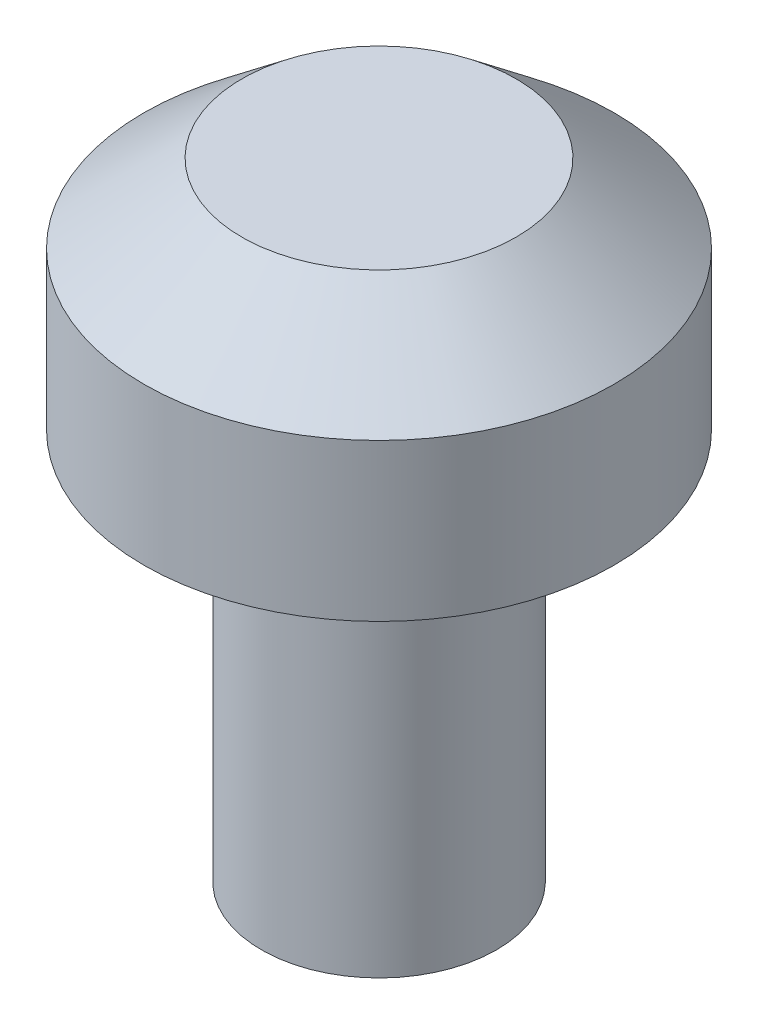
ISO-10303-21;
HEADER;
FILE_DESCRIPTION(('STEP AP214'),'2;1');
FILE_NAME('part.step','',(''),(''),'','','');
FILE_SCHEMA(('AUTOMOTIVE_DESIGN { 1 0 10303 214 1 1 1 1 }'));
ENDSEC;
DATA;
#1=APPLICATION_CONTEXT('core data for automotive mechanical design processes');
#2=APPLICATION_PROTOCOL_DEFINITION('international standard','automotive_design',2000,#1);
#3=PRODUCT_CONTEXT('',#1,'mechanical');
#4=PRODUCT('Part','Part','',(#3));
#5=PRODUCT_RELATED_PRODUCT_CATEGORY('part','',(#4));
#6=PRODUCT_DEFINITION_FORMATION('','',#4);
#7=PRODUCT_DEFINITION_CONTEXT('part definition',#1,'design');
#8=PRODUCT_DEFINITION('design','',#6,#7);
#9=PRODUCT_DEFINITION_SHAPE('','',#8);
#10=(LENGTH_UNIT() NAMED_UNIT(*) SI_UNIT(.MILLI.,.METRE.));
#11=(NAMED_UNIT(*) PLANE_ANGLE_UNIT() SI_UNIT($,.RADIAN.));
#12=(NAMED_UNIT(*) SI_UNIT($,.STERADIAN.) SOLID_ANGLE_UNIT());
#13=UNCERTAINTY_MEASURE_WITH_UNIT(LENGTH_MEASURE(1.E-05),#10,'distance_accuracy_value','');
#14=(GEOMETRIC_REPRESENTATION_CONTEXT(3) GLOBAL_UNCERTAINTY_ASSIGNED_CONTEXT((#13)) GLOBAL_UNIT_ASSIGNED_CONTEXT((#10,
#11,#12)) REPRESENTATION_CONTEXT('',''));
#15=CARTESIAN_POINT('',(0.,0.,0.));
#16=DIRECTION('',(0.,0.,1.));
#17=DIRECTION('',(1.,0.,0.));
#18=AXIS2_PLACEMENT_3D('',#15,#16,#17);
#19=CARTESIAN_POINT('',(0.,0.,0.));
#20=DIRECTION('',(0.,-1.,0.));
#21=DIRECTION('',(1.,0.,0.));
#22=AXIS2_PLACEMENT_3D('',#19,#20,#21);
#23=PLANE('',#22);
#24=CARTESIAN_POINT('',(0.,0.,0.));
#25=DIRECTION('',(0.,-1.,0.));
#26=DIRECTION('',(1.,0.,0.));
#27=AXIS2_PLACEMENT_3D('',#24,#25,#26);
#28=CIRCLE('',#27,1.5);
#29=CARTESIAN_POINT('',(1.5,0.,0.));
#30=VERTEX_POINT('',#29);
#31=EDGE_CURVE('E52',#30,#30,#28,.T.);
#32=ORIENTED_EDGE('',*,*,#31,.T.);
#33=EDGE_LOOP('',(#32));
#34=FACE_BOUND('',#33,.T.);
#35=ADVANCED_FACE('F33',(#34),#23,.T.);
#36=CARTESIAN_POINT('',(0.,8.,0.));
#37=DIRECTION('',(0.,1.,0.));
#38=DIRECTION('',(-1.,0.,0.));
#39=AXIS2_PLACEMENT_3D('',#36,#37,#38);
#40=PLANE('',#39);
#41=CARTESIAN_POINT('',(0.,8.,0.));
#42=DIRECTION('',(0.,-1.,0.));
#43=DIRECTION('',(1.,0.,0.));
#44=AXIS2_PLACEMENT_3D('',#41,#42,#43);
#45=CIRCLE('',#44,1.75);
#46=CARTESIAN_POINT('',(1.75,8.,0.));
#47=VERTEX_POINT('',#46);
#48=EDGE_CURVE('E10',#47,#47,#45,.T.);
#49=ORIENTED_EDGE('',*,*,#48,.F.);
#50=EDGE_LOOP('',(#49));
#51=FACE_BOUND('',#50,.T.);
#52=ADVANCED_FACE('F69',(#51),#40,.T.);
#53=CARTESIAN_POINT('',(0.,7.,0.));
#54=DIRECTION('',(0.,-1.,0.));
#55=DIRECTION('',(1.,0.,0.));
#56=AXIS2_PLACEMENT_3D('',#53,#54,#55);
#57=CONICAL_SURFACE('',#56,3.,0.896055384571343);
#58=ORIENTED_EDGE('',*,*,#48,.T.);
#59=EDGE_LOOP('',(#58));
#60=FACE_BOUND('',#59,.T.);
#61=CARTESIAN_POINT('',(0.,7.,0.));
#62=DIRECTION('',(0.,-1.,0.));
#63=DIRECTION('',(1.,0.,0.));
#64=AXIS2_PLACEMENT_3D('',#61,#62,#63);
#65=CIRCLE('',#64,3.);
#66=CARTESIAN_POINT('',(3.,7.,0.));
#67=VERTEX_POINT('',#66);
#68=EDGE_CURVE('E39',#67,#67,#65,.T.);
#69=ORIENTED_EDGE('',*,*,#68,.F.);
#70=EDGE_LOOP('',(#69));
#71=FACE_BOUND('',#70,.T.);
#72=ADVANCED_FACE('F73',(#60,#71),#57,.T.);
#73=CARTESIAN_POINT('',(0.,0.,0.));
#74=DIRECTION('',(0.,-1.,0.));
#75=DIRECTION('',(1.,0.,0.));
#76=AXIS2_PLACEMENT_3D('',#73,#74,#75);
#77=CYLINDRICAL_SURFACE('',#76,3.);
#78=ORIENTED_EDGE('',*,*,#68,.T.);
#79=EDGE_LOOP('',(#78));
#80=FACE_BOUND('',#79,.T.);
#81=CARTESIAN_POINT('',(0.,5.,0.));
#82=DIRECTION('',(0.,-1.,0.));
#83=DIRECTION('',(1.,0.,0.));
#84=AXIS2_PLACEMENT_3D('',#81,#82,#83);
#85=CIRCLE('',#84,3.);
#86=CARTESIAN_POINT('',(3.,5.,0.));
#87=VERTEX_POINT('',#86);
#88=EDGE_CURVE('E43',#87,#87,#85,.T.);
#89=ORIENTED_EDGE('',*,*,#88,.F.);
#90=EDGE_LOOP('',(#89));
#91=FACE_BOUND('',#90,.T.);
#92=ADVANCED_FACE('F65',(#80,#91),#77,.T.);
#93=CARTESIAN_POINT('',(0.,5.,0.));
#94=DIRECTION('',(0.,-1.,0.));
#95=DIRECTION('',(1.,0.,0.));
#96=AXIS2_PLACEMENT_3D('',#93,#94,#95);
#97=PLANE('',#96);
#98=ORIENTED_EDGE('',*,*,#88,.T.);
#99=EDGE_LOOP('',(#98));
#100=FACE_BOUND('',#99,.T.);
#101=CARTESIAN_POINT('',(0.,5.,0.));
#102=DIRECTION('',(0.,-1.,0.));
#103=DIRECTION('',(1.,0.,0.));
#104=AXIS2_PLACEMENT_3D('',#101,#102,#103);
#105=CIRCLE('',#104,1.5);
#106=CARTESIAN_POINT('',(1.5,5.,0.));
#107=VERTEX_POINT('',#106);
#108=EDGE_CURVE('E47',#107,#107,#105,.T.);
#109=ORIENTED_EDGE('',*,*,#108,.F.);
#110=EDGE_LOOP('',(#109));
#111=FACE_BOUND('',#110,.T.);
#112=ADVANCED_FACE('F59',(#100,#111),#97,.T.);
#113=CARTESIAN_POINT('',(0.,0.,0.));
#114=DIRECTION('',(0.,-1.,0.));
#115=DIRECTION('',(1.,0.,0.));
#116=AXIS2_PLACEMENT_3D('',#113,#114,#115);
#117=CYLINDRICAL_SURFACE('',#116,1.5);
#118=ORIENTED_EDGE('',*,*,#108,.T.);
#119=EDGE_LOOP('',(#118));
#120=FACE_BOUND('',#119,.T.);
#121=ORIENTED_EDGE('',*,*,#31,.F.);
#122=EDGE_LOOP('',(#121));
#123=FACE_BOUND('',#122,.T.);
#124=ADVANCED_FACE('F57',(#120,#123),#117,.T.);
#125=CLOSED_SHELL('',(#35,#52,#72,#92,#112,#124));
#126=MANIFOLD_SOLID_BREP('B2',#125);
#127=ADVANCED_BREP_SHAPE_REPRESENTATION('',(#18,#126),#14);
#128=SHAPE_DEFINITION_REPRESENTATION(#9,#127);
ENDSEC;
END-ISO-10303-21;
